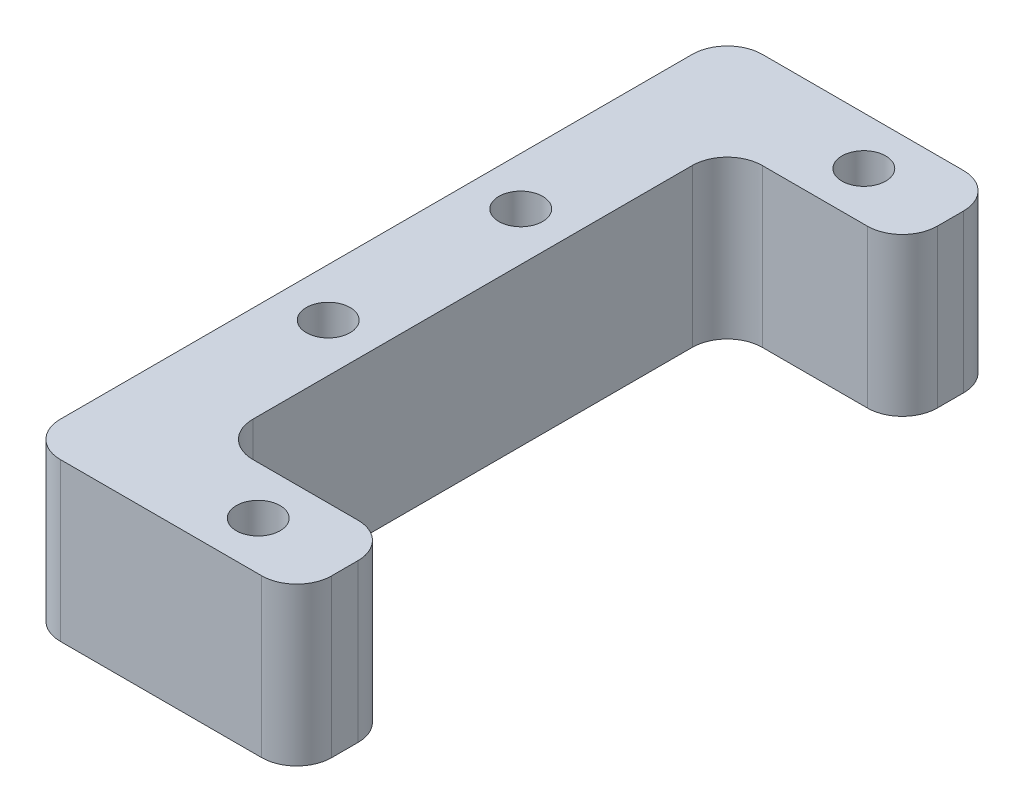
ISO-10303-21;
HEADER;
FILE_DESCRIPTION(('STEP AP214'),'2;1');
FILE_NAME('part.step','',(''),(''),'','','');
FILE_SCHEMA(('AUTOMOTIVE_DESIGN { 1 0 10303 214 1 1 1 1 }'));
ENDSEC;
DATA;
#1=APPLICATION_CONTEXT('core data for automotive mechanical design processes');
#2=APPLICATION_PROTOCOL_DEFINITION('international standard','automotive_design',2000,#1);
#3=PRODUCT_CONTEXT('',#1,'mechanical');
#4=PRODUCT('Part','Part','',(#3));
#5=PRODUCT_RELATED_PRODUCT_CATEGORY('part','',(#4));
#6=PRODUCT_DEFINITION_FORMATION('','',#4);
#7=PRODUCT_DEFINITION_CONTEXT('part definition',#1,'design');
#8=PRODUCT_DEFINITION('design','',#6,#7);
#9=PRODUCT_DEFINITION_SHAPE('','',#8);
#10=(LENGTH_UNIT() NAMED_UNIT(*) SI_UNIT(.MILLI.,.METRE.));
#11=(NAMED_UNIT(*) PLANE_ANGLE_UNIT() SI_UNIT($,.RADIAN.));
#12=(NAMED_UNIT(*) SI_UNIT($,.STERADIAN.) SOLID_ANGLE_UNIT());
#13=UNCERTAINTY_MEASURE_WITH_UNIT(LENGTH_MEASURE(1.E-05),#10,'distance_accuracy_value','');
#14=(GEOMETRIC_REPRESENTATION_CONTEXT(3) GLOBAL_UNCERTAINTY_ASSIGNED_CONTEXT((#13)) GLOBAL_UNIT_ASSIGNED_CONTEXT((#10,
#11,#12)) REPRESENTATION_CONTEXT('',''));
#15=CARTESIAN_POINT('',(0.,0.,0.));
#16=DIRECTION('',(0.,0.,1.));
#17=DIRECTION('',(1.,0.,0.));
#18=AXIS2_PLACEMENT_3D('',#15,#16,#17);
#19=CARTESIAN_POINT('',(0.,9.,0.));
#20=DIRECTION('',(0.,-1.,0.));
#21=DIRECTION('',(0.,0.,-1.));
#22=AXIS2_PLACEMENT_3D('',#19,#20,#21);
#23=PLANE('',#22);
#24=DIRECTION('',(0.,0.,-1.));
#25=VECTOR('',#24,1.);
#26=CARTESIAN_POINT('',(15.5,9.,-20.05));
#27=LINE('',#26,#25);
#28=CARTESIAN_POINT('',(15.5,9.,-16.55));
#29=VERTEX_POINT('',#28);
#30=CARTESIAN_POINT('',(15.5,9.,-18.05));
#31=VERTEX_POINT('',#30);
#32=EDGE_CURVE('E184',#29,#31,#27,.T.);
#33=ORIENTED_EDGE('',*,*,#32,.T.);
#34=CARTESIAN_POINT('',(13.5,9.,-18.05));
#35=DIRECTION('',(0.,-1.,0.));
#36=DIRECTION('',(0.,0.,-1.));
#37=AXIS2_PLACEMENT_3D('',#34,#35,#36);
#38=CIRCLE('',#37,2.);
#39=CARTESIAN_POINT('',(13.5,9.,-20.05));
#40=VERTEX_POINT('',#39);
#41=EDGE_CURVE('E224',#31,#40,#38,.F.);
#42=ORIENTED_EDGE('',*,*,#41,.T.);
#43=DIRECTION('',(-1.,0.,0.));
#44=VECTOR('',#43,1.);
#45=CARTESIAN_POINT('',(0.,9.,-20.05));
#46=LINE('',#45,#44);
#47=CARTESIAN_POINT('',(2.,9.,-20.05));
#48=VERTEX_POINT('',#47);
#49=EDGE_CURVE('E167',#40,#48,#46,.T.);
#50=ORIENTED_EDGE('',*,*,#49,.T.);
#51=CARTESIAN_POINT('',(2.,9.,-18.05));
#52=DIRECTION('',(0.,-1.,0.));
#53=DIRECTION('',(0.,0.,-1.));
#54=AXIS2_PLACEMENT_3D('',#51,#52,#53);
#55=CIRCLE('',#54,2.);
#56=CARTESIAN_POINT('',(0.,9.,-18.05));
#57=VERTEX_POINT('',#56);
#58=EDGE_CURVE('E214',#48,#57,#55,.F.);
#59=ORIENTED_EDGE('',*,*,#58,.T.);
#60=DIRECTION('',(0.,0.,1.));
#61=VECTOR('',#60,1.);
#62=CARTESIAN_POINT('',(0.,9.,20.05));
#63=LINE('',#62,#61);
#64=CARTESIAN_POINT('',(0.,9.,18.05));
#65=VERTEX_POINT('',#64);
#66=EDGE_CURVE('E286',#57,#65,#63,.T.);
#67=ORIENTED_EDGE('',*,*,#66,.T.);
#68=CARTESIAN_POINT('',(2.,9.,18.05));
#69=DIRECTION('',(0.,-1.,0.));
#70=DIRECTION('',(0.,0.,-1.));
#71=AXIS2_PLACEMENT_3D('',#68,#69,#70);
#72=CIRCLE('',#71,2.);
#73=CARTESIAN_POINT('',(2.,9.,20.05));
#74=VERTEX_POINT('',#73);
#75=EDGE_CURVE('E216',#65,#74,#72,.F.);
#76=ORIENTED_EDGE('',*,*,#75,.T.);
#77=DIRECTION('',(1.,0.,0.));
#78=VECTOR('',#77,1.);
#79=CARTESIAN_POINT('',(0.,9.,20.05));
#80=LINE('',#79,#78);
#81=CARTESIAN_POINT('',(13.5,9.,20.05));
#82=VERTEX_POINT('',#81);
#83=EDGE_CURVE('E283',#74,#82,#80,.T.);
#84=ORIENTED_EDGE('',*,*,#83,.T.);
#85=CARTESIAN_POINT('',(13.5,9.,18.05));
#86=DIRECTION('',(0.,-1.,0.));
#87=DIRECTION('',(0.,0.,-1.));
#88=AXIS2_PLACEMENT_3D('',#85,#86,#87);
#89=CIRCLE('',#88,2.);
#90=CARTESIAN_POINT('',(15.5,9.,18.05));
#91=VERTEX_POINT('',#90);
#92=EDGE_CURVE('E218',#82,#91,#89,.F.);
#93=ORIENTED_EDGE('',*,*,#92,.T.);
#94=DIRECTION('',(0.,0.,-1.));
#95=VECTOR('',#94,1.);
#96=CARTESIAN_POINT('',(15.5,9.,20.05));
#97=LINE('',#96,#95);
#98=CARTESIAN_POINT('',(15.5,9.,16.55));
#99=VERTEX_POINT('',#98);
#100=EDGE_CURVE('E278',#91,#99,#97,.T.);
#101=ORIENTED_EDGE('',*,*,#100,.T.);
#102=CARTESIAN_POINT('',(13.5,9.,16.55));
#103=DIRECTION('',(0.,-1.,0.));
#104=DIRECTION('',(0.,0.,-1.));
#105=AXIS2_PLACEMENT_3D('',#102,#103,#104);
#106=CIRCLE('',#105,2.);
#107=CARTESIAN_POINT('',(13.5,9.,14.55));
#108=VERTEX_POINT('',#107);
#109=EDGE_CURVE('E220',#99,#108,#106,.F.);
#110=ORIENTED_EDGE('',*,*,#109,.T.);
#111=DIRECTION('',(-1.,0.,0.));
#112=VECTOR('',#111,1.);
#113=CARTESIAN_POINT('',(15.5,9.,14.55));
#114=LINE('',#113,#112);
#115=CARTESIAN_POINT('',(7.49999999999999,9.,14.55));
#116=VERTEX_POINT('',#115);
#117=EDGE_CURVE('E272',#108,#116,#114,.T.);
#118=ORIENTED_EDGE('',*,*,#117,.T.);
#119=CARTESIAN_POINT('',(7.5,9.,12.55));
#120=DIRECTION('',(0.,-1.,0.));
#121=DIRECTION('',(0.,0.,-1.));
#122=AXIS2_PLACEMENT_3D('',#119,#120,#121);
#123=CIRCLE('',#122,2.);
#124=CARTESIAN_POINT('',(5.5,9.,12.55));
#125=VERTEX_POINT('',#124);
#126=EDGE_CURVE('E11',#116,#125,#123,.T.);
#127=ORIENTED_EDGE('',*,*,#126,.T.);
#128=DIRECTION('',(0.,0.,-1.));
#129=VECTOR('',#128,1.);
#130=CARTESIAN_POINT('',(5.5,9.,-14.55));
#131=LINE('',#130,#129);
#132=CARTESIAN_POINT('',(5.5,9.,-12.55));
#133=VERTEX_POINT('',#132);
#134=EDGE_CURVE('E271',#125,#133,#131,.T.);
#135=ORIENTED_EDGE('',*,*,#134,.T.);
#136=CARTESIAN_POINT('',(7.5,9.,-12.55));
#137=DIRECTION('',(0.,-1.,0.));
#138=DIRECTION('',(0.,0.,-1.));
#139=AXIS2_PLACEMENT_3D('',#136,#137,#138);
#140=CIRCLE('',#139,2.);
#141=CARTESIAN_POINT('',(7.49999999999999,9.,-14.55));
#142=VERTEX_POINT('',#141);
#143=EDGE_CURVE('E55',#133,#142,#140,.T.);
#144=ORIENTED_EDGE('',*,*,#143,.T.);
#145=DIRECTION('',(1.,0.,0.));
#146=VECTOR('',#145,1.);
#147=CARTESIAN_POINT('',(15.5,9.,-14.55));
#148=LINE('',#147,#146);
#149=CARTESIAN_POINT('',(13.5,9.,-14.55));
#150=VERTEX_POINT('',#149);
#151=EDGE_CURVE('E276',#142,#150,#148,.T.);
#152=ORIENTED_EDGE('',*,*,#151,.T.);
#153=CARTESIAN_POINT('',(13.5,9.,-16.55));
#154=DIRECTION('',(0.,-1.,0.));
#155=DIRECTION('',(0.,0.,-1.));
#156=AXIS2_PLACEMENT_3D('',#153,#154,#155);
#157=CIRCLE('',#156,2.);
#158=EDGE_CURVE('E222',#150,#29,#157,.F.);
#159=ORIENTED_EDGE('',*,*,#158,.T.);
#160=EDGE_LOOP('',(#33,#42,#50,#59,#67,#76,#84,#93,#101,#110,#118,#127,#135,#144,#152,#159));
#161=FACE_BOUND('',#160,.T.);
#162=CARTESIAN_POINT('',(2.75,9.,-5.5));
#163=DIRECTION('',(0.,1.,0.));
#164=DIRECTION('',(0.,0.,1.));
#165=AXIS2_PLACEMENT_3D('',#162,#163,#164);
#166=CIRCLE('',#165,1.25);
#167=CARTESIAN_POINT('',(2.75,9.,-4.25));
#168=VERTEX_POINT('',#167);
#169=EDGE_CURVE('E175',#168,#168,#166,.T.);
#170=ORIENTED_EDGE('',*,*,#169,.F.);
#171=EDGE_LOOP('',(#170));
#172=FACE_BOUND('',#171,.T.);
#173=CARTESIAN_POINT('',(10.55,9.,-17.3));
#174=DIRECTION('',(0.,1.,0.));
#175=DIRECTION('',(0.,0.,1.));
#176=AXIS2_PLACEMENT_3D('',#173,#174,#175);
#177=CIRCLE('',#176,1.25);
#178=CARTESIAN_POINT('',(10.55,9.,-16.05));
#179=VERTEX_POINT('',#178);
#180=EDGE_CURVE('E291',#179,#179,#177,.T.);
#181=ORIENTED_EDGE('',*,*,#180,.F.);
#182=EDGE_LOOP('',(#181));
#183=FACE_BOUND('',#182,.T.);
#184=CARTESIAN_POINT('',(10.55,9.,17.3));
#185=DIRECTION('',(0.,1.,0.));
#186=DIRECTION('',(0.,0.,-1.));
#187=AXIS2_PLACEMENT_3D('',#184,#185,#186);
#188=CIRCLE('',#187,1.25);
#189=CARTESIAN_POINT('',(10.55,9.,16.05));
#190=VERTEX_POINT('',#189);
#191=EDGE_CURVE('E296',#190,#190,#188,.T.);
#192=ORIENTED_EDGE('',*,*,#191,.F.);
#193=EDGE_LOOP('',(#192));
#194=FACE_BOUND('',#193,.T.);
#195=CARTESIAN_POINT('',(2.75,9.,5.5));
#196=DIRECTION('',(0.,1.,0.));
#197=DIRECTION('',(0.,0.,-1.));
#198=AXIS2_PLACEMENT_3D('',#195,#196,#197);
#199=CIRCLE('',#198,1.25);
#200=CARTESIAN_POINT('',(2.75,9.,4.25));
#201=VERTEX_POINT('',#200);
#202=EDGE_CURVE('E302',#201,#201,#199,.T.);
#203=ORIENTED_EDGE('',*,*,#202,.F.);
#204=EDGE_LOOP('',(#203));
#205=FACE_BOUND('',#204,.T.);
#206=ADVANCED_FACE('F33',(#161,#172,#183,#194,#205),#23,.F.);
#207=CARTESIAN_POINT('',(0.,0.,0.));
#208=DIRECTION('',(0.,-1.,0.));
#209=DIRECTION('',(0.,0.,-1.));
#210=AXIS2_PLACEMENT_3D('',#207,#208,#209);
#211=PLANE('',#210);
#212=CARTESIAN_POINT('',(10.55,0.,17.3));
#213=DIRECTION('',(0.,1.,0.));
#214=DIRECTION('',(0.,0.,-1.));
#215=AXIS2_PLACEMENT_3D('',#212,#213,#214);
#216=CIRCLE('',#215,1.25);
#217=CARTESIAN_POINT('',(10.55,0.,16.05));
#218=VERTEX_POINT('',#217);
#219=EDGE_CURVE('E299',#218,#218,#216,.T.);
#220=ORIENTED_EDGE('',*,*,#219,.T.);
#221=EDGE_LOOP('',(#220));
#222=FACE_BOUND('',#221,.T.);
#223=CARTESIAN_POINT('',(2.75,0.,-5.5));
#224=DIRECTION('',(0.,1.,0.));
#225=DIRECTION('',(0.,0.,1.));
#226=AXIS2_PLACEMENT_3D('',#223,#224,#225);
#227=CIRCLE('',#226,1.25);
#228=CARTESIAN_POINT('',(2.75,0.,-4.25));
#229=VERTEX_POINT('',#228);
#230=EDGE_CURVE('E181',#229,#229,#227,.T.);
#231=ORIENTED_EDGE('',*,*,#230,.T.);
#232=EDGE_LOOP('',(#231));
#233=FACE_BOUND('',#232,.T.);
#234=DIRECTION('',(-1.,0.,0.));
#235=VECTOR('',#234,1.);
#236=CARTESIAN_POINT('',(0.,0.,-20.05));
#237=LINE('',#236,#235);
#238=CARTESIAN_POINT('',(13.5,0.,-20.05));
#239=VERTEX_POINT('',#238);
#240=CARTESIAN_POINT('',(2.,0.,-20.05));
#241=VERTEX_POINT('',#240);
#242=EDGE_CURVE('E164',#239,#241,#237,.T.);
#243=ORIENTED_EDGE('',*,*,#242,.F.);
#244=CARTESIAN_POINT('',(13.5,0.,-18.05));
#245=DIRECTION('',(0.,-1.,0.));
#246=DIRECTION('',(0.,0.,-1.));
#247=AXIS2_PLACEMENT_3D('',#244,#245,#246);
#248=CIRCLE('',#247,2.);
#249=CARTESIAN_POINT('',(15.5,0.,-18.05));
#250=VERTEX_POINT('',#249);
#251=EDGE_CURVE('E147',#239,#250,#248,.T.);
#252=ORIENTED_EDGE('',*,*,#251,.T.);
#253=DIRECTION('',(0.,0.,-1.));
#254=VECTOR('',#253,1.);
#255=CARTESIAN_POINT('',(15.5,0.,-20.05));
#256=LINE('',#255,#254);
#257=CARTESIAN_POINT('',(15.5,0.,-16.55));
#258=VERTEX_POINT('',#257);
#259=EDGE_CURVE('E200',#258,#250,#256,.T.);
#260=ORIENTED_EDGE('',*,*,#259,.F.);
#261=CARTESIAN_POINT('',(13.5,0.,-16.55));
#262=DIRECTION('',(0.,-1.,0.));
#263=DIRECTION('',(0.,0.,-1.));
#264=AXIS2_PLACEMENT_3D('',#261,#262,#263);
#265=CIRCLE('',#264,2.);
#266=CARTESIAN_POINT('',(13.5,0.,-14.55));
#267=VERTEX_POINT('',#266);
#268=EDGE_CURVE('E158',#258,#267,#265,.T.);
#269=ORIENTED_EDGE('',*,*,#268,.T.);
#270=DIRECTION('',(1.,0.,0.));
#271=VECTOR('',#270,1.);
#272=CARTESIAN_POINT('',(15.5,0.,-14.55));
#273=LINE('',#272,#271);
#274=CARTESIAN_POINT('',(7.49999999999999,0.,-14.55));
#275=VERTEX_POINT('',#274);
#276=EDGE_CURVE('E198',#275,#267,#273,.T.);
#277=ORIENTED_EDGE('',*,*,#276,.F.);
#278=CARTESIAN_POINT('',(7.5,0.,-12.55));
#279=DIRECTION('',(0.,-1.,0.));
#280=DIRECTION('',(0.,0.,-1.));
#281=AXIS2_PLACEMENT_3D('',#278,#279,#280);
#282=CIRCLE('',#281,2.);
#283=CARTESIAN_POINT('',(5.5,0.,-12.55));
#284=VERTEX_POINT('',#283);
#285=EDGE_CURVE('E255',#275,#284,#282,.F.);
#286=ORIENTED_EDGE('',*,*,#285,.T.);
#287=DIRECTION('',(0.,0.,-1.));
#288=VECTOR('',#287,1.);
#289=CARTESIAN_POINT('',(5.5,0.,-14.55));
#290=LINE('',#289,#288);
#291=CARTESIAN_POINT('',(5.5,0.,12.55));
#292=VERTEX_POINT('',#291);
#293=EDGE_CURVE('E195',#292,#284,#290,.T.);
#294=ORIENTED_EDGE('',*,*,#293,.F.);
#295=CARTESIAN_POINT('',(7.5,0.,12.55));
#296=DIRECTION('',(0.,-1.,0.));
#297=DIRECTION('',(0.,0.,-1.));
#298=AXIS2_PLACEMENT_3D('',#295,#296,#297);
#299=CIRCLE('',#298,2.);
#300=CARTESIAN_POINT('',(7.49999999999999,0.,14.55));
#301=VERTEX_POINT('',#300);
#302=EDGE_CURVE('E41',#292,#301,#299,.F.);
#303=ORIENTED_EDGE('',*,*,#302,.T.);
#304=DIRECTION('',(-1.,0.,0.));
#305=VECTOR('',#304,1.);
#306=CARTESIAN_POINT('',(15.5,0.,14.55));
#307=LINE('',#306,#305);
#308=CARTESIAN_POINT('',(13.5,0.,14.55));
#309=VERTEX_POINT('',#308);
#310=EDGE_CURVE('E192',#309,#301,#307,.T.);
#311=ORIENTED_EDGE('',*,*,#310,.F.);
#312=CARTESIAN_POINT('',(13.5,0.,16.55));
#313=DIRECTION('',(0.,-1.,0.));
#314=DIRECTION('',(0.,0.,-1.));
#315=AXIS2_PLACEMENT_3D('',#312,#313,#314);
#316=CIRCLE('',#315,2.);
#317=CARTESIAN_POINT('',(15.5,0.,16.55));
#318=VERTEX_POINT('',#317);
#319=EDGE_CURVE('E208',#309,#318,#316,.T.);
#320=ORIENTED_EDGE('',*,*,#319,.T.);
#321=DIRECTION('',(0.,0.,-1.));
#322=VECTOR('',#321,1.);
#323=CARTESIAN_POINT('',(15.5,0.,20.05));
#324=LINE('',#323,#322);
#325=CARTESIAN_POINT('',(15.5,0.,18.05));
#326=VERTEX_POINT('',#325);
#327=EDGE_CURVE('E189',#326,#318,#324,.T.);
#328=ORIENTED_EDGE('',*,*,#327,.F.);
#329=CARTESIAN_POINT('',(13.5,0.,18.05));
#330=DIRECTION('',(0.,-1.,0.));
#331=DIRECTION('',(0.,0.,-1.));
#332=AXIS2_PLACEMENT_3D('',#329,#330,#331);
#333=CIRCLE('',#332,2.);
#334=CARTESIAN_POINT('',(13.5,0.,20.05));
#335=VERTEX_POINT('',#334);
#336=EDGE_CURVE('E206',#326,#335,#333,.T.);
#337=ORIENTED_EDGE('',*,*,#336,.T.);
#338=DIRECTION('',(1.,0.,0.));
#339=VECTOR('',#338,1.);
#340=CARTESIAN_POINT('',(0.,0.,20.05));
#341=LINE('',#340,#339);
#342=CARTESIAN_POINT('',(2.,0.,20.05));
#343=VERTEX_POINT('',#342);
#344=EDGE_CURVE('E178',#343,#335,#341,.T.);
#345=ORIENTED_EDGE('',*,*,#344,.F.);
#346=CARTESIAN_POINT('',(2.,0.,18.05));
#347=DIRECTION('',(0.,-1.,0.));
#348=DIRECTION('',(0.,0.,-1.));
#349=AXIS2_PLACEMENT_3D('',#346,#347,#348);
#350=CIRCLE('',#349,2.);
#351=CARTESIAN_POINT('',(0.,0.,18.05));
#352=VERTEX_POINT('',#351);
#353=EDGE_CURVE('E204',#343,#352,#350,.T.);
#354=ORIENTED_EDGE('',*,*,#353,.T.);
#355=DIRECTION('',(0.,0.,1.));
#356=VECTOR('',#355,1.);
#357=CARTESIAN_POINT('',(0.,0.,20.05));
#358=LINE('',#357,#356);
#359=CARTESIAN_POINT('',(0.,0.,-18.05));
#360=VERTEX_POINT('',#359);
#361=EDGE_CURVE('E174',#360,#352,#358,.T.);
#362=ORIENTED_EDGE('',*,*,#361,.F.);
#363=CARTESIAN_POINT('',(2.,0.,-18.05));
#364=DIRECTION('',(0.,-1.,0.));
#365=DIRECTION('',(0.,0.,-1.));
#366=AXIS2_PLACEMENT_3D('',#363,#364,#365);
#367=CIRCLE('',#366,2.);
#368=EDGE_CURVE('E168',#360,#241,#367,.T.);
#369=ORIENTED_EDGE('',*,*,#368,.T.);
#370=EDGE_LOOP('',(#243,#252,#260,#269,#277,#286,#294,#303,#311,#320,#328,#337,#345,#354,#362,#369));
#371=FACE_BOUND('',#370,.T.);
#372=CARTESIAN_POINT('',(10.55,0.,-17.3));
#373=DIRECTION('',(0.,1.,0.));
#374=DIRECTION('',(0.,0.,1.));
#375=AXIS2_PLACEMENT_3D('',#372,#373,#374);
#376=CIRCLE('',#375,1.25);
#377=CARTESIAN_POINT('',(10.55,0.,-16.05));
#378=VERTEX_POINT('',#377);
#379=EDGE_CURVE('E293',#378,#378,#376,.T.);
#380=ORIENTED_EDGE('',*,*,#379,.T.);
#381=EDGE_LOOP('',(#380));
#382=FACE_BOUND('',#381,.T.);
#383=CARTESIAN_POINT('',(2.75,0.,5.5));
#384=DIRECTION('',(0.,1.,0.));
#385=DIRECTION('',(0.,0.,-1.));
#386=AXIS2_PLACEMENT_3D('',#383,#384,#385);
#387=CIRCLE('',#386,1.25);
#388=CARTESIAN_POINT('',(2.75,0.,4.25));
#389=VERTEX_POINT('',#388);
#390=EDGE_CURVE('E305',#389,#389,#387,.T.);
#391=ORIENTED_EDGE('',*,*,#390,.T.);
#392=EDGE_LOOP('',(#391));
#393=FACE_BOUND('',#392,.T.);
#394=ADVANCED_FACE('F171',(#222,#233,#371,#382,#393),#211,.T.);
#395=CARTESIAN_POINT('',(0.,9.,-20.05));
#396=DIRECTION('',(0.,0.,1.));
#397=DIRECTION('',(1.,0.,0.));
#398=AXIS2_PLACEMENT_3D('',#395,#396,#397);
#399=PLANE('',#398);
#400=ORIENTED_EDGE('',*,*,#49,.F.);
#401=DIRECTION('',(0.,-1.,0.));
#402=VECTOR('',#401,1.);
#403=CARTESIAN_POINT('',(13.5,9.,-20.05));
#404=LINE('',#403,#402);
#405=EDGE_CURVE('E151',#40,#239,#404,.T.);
#406=ORIENTED_EDGE('',*,*,#405,.T.);
#407=ORIENTED_EDGE('',*,*,#242,.T.);
#408=DIRECTION('',(0.,-1.,0.));
#409=VECTOR('',#408,1.);
#410=CARTESIAN_POINT('',(2.,9.,-20.05));
#411=LINE('',#410,#409);
#412=EDGE_CURVE('E169',#241,#48,#411,.F.);
#413=ORIENTED_EDGE('',*,*,#412,.T.);
#414=EDGE_LOOP('',(#400,#406,#407,#413));
#415=FACE_BOUND('',#414,.T.);
#416=ADVANCED_FACE('F163',(#415),#399,.F.);
#417=CARTESIAN_POINT('',(0.,9.,20.05));
#418=DIRECTION('',(1.,0.,0.));
#419=DIRECTION('',(0.,0.,-1.));
#420=AXIS2_PLACEMENT_3D('',#417,#418,#419);
#421=PLANE('',#420);
#422=ORIENTED_EDGE('',*,*,#361,.T.);
#423=DIRECTION('',(0.,-1.,0.));
#424=VECTOR('',#423,1.);
#425=CARTESIAN_POINT('',(0.,9.,18.05));
#426=LINE('',#425,#424);
#427=EDGE_CURVE('E248',#352,#65,#426,.F.);
#428=ORIENTED_EDGE('',*,*,#427,.T.);
#429=ORIENTED_EDGE('',*,*,#66,.F.);
#430=DIRECTION('',(0.,-1.,0.));
#431=VECTOR('',#430,1.);
#432=CARTESIAN_POINT('',(0.,9.,-18.05));
#433=LINE('',#432,#431);
#434=EDGE_CURVE('E245',#57,#360,#433,.T.);
#435=ORIENTED_EDGE('',*,*,#434,.T.);
#436=EDGE_LOOP('',(#422,#428,#429,#435));
#437=FACE_BOUND('',#436,.T.);
#438=ADVANCED_FACE('F343',(#437),#421,.F.);
#439=CARTESIAN_POINT('',(0.,9.,20.05));
#440=DIRECTION('',(0.,0.,-1.));
#441=DIRECTION('',(-1.,0.,0.));
#442=AXIS2_PLACEMENT_3D('',#439,#440,#441);
#443=PLANE('',#442);
#444=ORIENTED_EDGE('',*,*,#344,.T.);
#445=DIRECTION('',(0.,-1.,0.));
#446=VECTOR('',#445,1.);
#447=CARTESIAN_POINT('',(13.5,9.,20.05));
#448=LINE('',#447,#446);
#449=EDGE_CURVE('E243',#335,#82,#448,.F.);
#450=ORIENTED_EDGE('',*,*,#449,.T.);
#451=ORIENTED_EDGE('',*,*,#83,.F.);
#452=DIRECTION('',(0.,-1.,0.));
#453=VECTOR('',#452,1.);
#454=CARTESIAN_POINT('',(2.,9.,20.05));
#455=LINE('',#454,#453);
#456=EDGE_CURVE('E240',#74,#343,#455,.T.);
#457=ORIENTED_EDGE('',*,*,#456,.T.);
#458=EDGE_LOOP('',(#444,#450,#451,#457));
#459=FACE_BOUND('',#458,.T.);
#460=ADVANCED_FACE('F339',(#459),#443,.F.);
#461=CARTESIAN_POINT('',(15.5,9.,20.05));
#462=DIRECTION('',(-1.,0.,0.));
#463=DIRECTION('',(0.,0.,1.));
#464=AXIS2_PLACEMENT_3D('',#461,#462,#463);
#465=PLANE('',#464);
#466=ORIENTED_EDGE('',*,*,#327,.T.);
#467=DIRECTION('',(0.,-1.,0.));
#468=VECTOR('',#467,1.);
#469=CARTESIAN_POINT('',(15.5,9.,16.55));
#470=LINE('',#469,#468);
#471=EDGE_CURVE('E238',#318,#99,#470,.F.);
#472=ORIENTED_EDGE('',*,*,#471,.T.);
#473=ORIENTED_EDGE('',*,*,#100,.F.);
#474=DIRECTION('',(0.,-1.,0.));
#475=VECTOR('',#474,1.);
#476=CARTESIAN_POINT('',(15.5,9.,18.05));
#477=LINE('',#476,#475);
#478=EDGE_CURVE('E235',#91,#326,#477,.T.);
#479=ORIENTED_EDGE('',*,*,#478,.T.);
#480=EDGE_LOOP('',(#466,#472,#473,#479));
#481=FACE_BOUND('',#480,.T.);
#482=ADVANCED_FACE('F336',(#481),#465,.F.);
#483=CARTESIAN_POINT('',(15.5,9.,14.55));
#484=DIRECTION('',(0.,0.,1.));
#485=DIRECTION('',(1.,0.,0.));
#486=AXIS2_PLACEMENT_3D('',#483,#484,#485);
#487=PLANE('',#486);
#488=ORIENTED_EDGE('',*,*,#117,.F.);
#489=DIRECTION('',(0.,-1.,0.));
#490=VECTOR('',#489,1.);
#491=CARTESIAN_POINT('',(13.5,9.,14.55));
#492=LINE('',#491,#490);
#493=EDGE_CURVE('E232',#108,#309,#492,.T.);
#494=ORIENTED_EDGE('',*,*,#493,.T.);
#495=ORIENTED_EDGE('',*,*,#310,.T.);
#496=DIRECTION('',(0.,-1.,0.));
#497=VECTOR('',#496,1.);
#498=CARTESIAN_POINT('',(7.5,9.,14.55));
#499=LINE('',#498,#497);
#500=EDGE_CURVE('E230',#301,#116,#499,.F.);
#501=ORIENTED_EDGE('',*,*,#500,.T.);
#502=EDGE_LOOP('',(#488,#494,#495,#501));
#503=FACE_BOUND('',#502,.T.);
#504=ADVANCED_FACE('F264',(#503),#487,.F.);
#505=CARTESIAN_POINT('',(5.5,9.,-14.55));
#506=DIRECTION('',(-1.,0.,0.));
#507=DIRECTION('',(0.,0.,1.));
#508=AXIS2_PLACEMENT_3D('',#505,#506,#507);
#509=PLANE('',#508);
#510=ORIENTED_EDGE('',*,*,#293,.T.);
#511=DIRECTION('',(0.,-1.,0.));
#512=VECTOR('',#511,1.);
#513=CARTESIAN_POINT('',(5.5,9.,-12.55));
#514=LINE('',#513,#512);
#515=EDGE_CURVE('E253',#284,#133,#514,.F.);
#516=ORIENTED_EDGE('',*,*,#515,.T.);
#517=ORIENTED_EDGE('',*,*,#134,.F.);
#518=DIRECTION('',(0.,-1.,0.));
#519=VECTOR('',#518,1.);
#520=CARTESIAN_POINT('',(5.5,0.,12.55));
#521=LINE('',#520,#519);
#522=EDGE_CURVE('E250',#125,#292,#521,.T.);
#523=ORIENTED_EDGE('',*,*,#522,.T.);
#524=EDGE_LOOP('',(#510,#516,#517,#523));
#525=FACE_BOUND('',#524,.T.);
#526=ADVANCED_FACE('F274',(#525),#509,.F.);
#527=CARTESIAN_POINT('',(15.5,9.,-14.55));
#528=DIRECTION('',(0.,0.,-1.));
#529=DIRECTION('',(-1.,0.,0.));
#530=AXIS2_PLACEMENT_3D('',#527,#528,#529);
#531=PLANE('',#530);
#532=ORIENTED_EDGE('',*,*,#276,.T.);
#533=DIRECTION('',(0.,-1.,0.));
#534=VECTOR('',#533,1.);
#535=CARTESIAN_POINT('',(13.5,9.,-14.55));
#536=LINE('',#535,#534);
#537=EDGE_CURVE('E48',#267,#150,#536,.F.);
#538=ORIENTED_EDGE('',*,*,#537,.T.);
#539=ORIENTED_EDGE('',*,*,#151,.F.);
#540=DIRECTION('',(0.,-1.,0.));
#541=VECTOR('',#540,1.);
#542=CARTESIAN_POINT('',(7.5,0.,-14.55));
#543=LINE('',#542,#541);
#544=EDGE_CURVE('E226',#142,#275,#543,.T.);
#545=ORIENTED_EDGE('',*,*,#544,.T.);
#546=EDGE_LOOP('',(#532,#538,#539,#545));
#547=FACE_BOUND('',#546,.T.);
#548=ADVANCED_FACE('F328',(#547),#531,.F.);
#549=CARTESIAN_POINT('',(15.5,9.,-20.05));
#550=DIRECTION('',(-1.,0.,0.));
#551=DIRECTION('',(0.,0.,1.));
#552=AXIS2_PLACEMENT_3D('',#549,#550,#551);
#553=PLANE('',#552);
#554=ORIENTED_EDGE('',*,*,#259,.T.);
#555=DIRECTION('',(0.,-1.,0.));
#556=VECTOR('',#555,1.);
#557=CARTESIAN_POINT('',(15.5,9.,-18.05));
#558=LINE('',#557,#556);
#559=EDGE_CURVE('E152',#250,#31,#558,.F.);
#560=ORIENTED_EDGE('',*,*,#559,.T.);
#561=ORIENTED_EDGE('',*,*,#32,.F.);
#562=DIRECTION('',(0.,-1.,0.));
#563=VECTOR('',#562,1.);
#564=CARTESIAN_POINT('',(15.5,9.,-16.55));
#565=LINE('',#564,#563);
#566=EDGE_CURVE('E157',#29,#258,#565,.T.);
#567=ORIENTED_EDGE('',*,*,#566,.T.);
#568=EDGE_LOOP('',(#554,#560,#561,#567));
#569=FACE_BOUND('',#568,.T.);
#570=ADVANCED_FACE('F325',(#569),#553,.F.);
#571=CARTESIAN_POINT('',(2.75,9.,-5.5));
#572=DIRECTION('',(0.,-1.,0.));
#573=DIRECTION('',(0.,0.,-1.));
#574=AXIS2_PLACEMENT_3D('',#571,#572,#573);
#575=CYLINDRICAL_SURFACE('',#574,1.25);
#576=ORIENTED_EDGE('',*,*,#169,.T.);
#577=EDGE_LOOP('',(#576));
#578=FACE_BOUND('',#577,.T.);
#579=ORIENTED_EDGE('',*,*,#230,.F.);
#580=EDGE_LOOP('',(#579));
#581=FACE_BOUND('',#580,.T.);
#582=ADVANCED_FACE('F322',(#578,#581),#575,.F.);
#583=CARTESIAN_POINT('',(10.55,9.,-17.3));
#584=DIRECTION('',(0.,-1.,0.));
#585=DIRECTION('',(0.,0.,-1.));
#586=AXIS2_PLACEMENT_3D('',#583,#584,#585);
#587=CYLINDRICAL_SURFACE('',#586,1.25);
#588=ORIENTED_EDGE('',*,*,#180,.T.);
#589=EDGE_LOOP('',(#588));
#590=FACE_BOUND('',#589,.T.);
#591=ORIENTED_EDGE('',*,*,#379,.F.);
#592=EDGE_LOOP('',(#591));
#593=FACE_BOUND('',#592,.T.);
#594=ADVANCED_FACE('F517',(#590,#593),#587,.F.);
#595=CARTESIAN_POINT('',(10.55,9.,17.3));
#596=DIRECTION('',(0.,-1.,0.));
#597=DIRECTION('',(0.,0.,-1.));
#598=AXIS2_PLACEMENT_3D('',#595,#596,#597);
#599=CYLINDRICAL_SURFACE('',#598,1.25);
#600=ORIENTED_EDGE('',*,*,#191,.T.);
#601=EDGE_LOOP('',(#600));
#602=FACE_BOUND('',#601,.T.);
#603=ORIENTED_EDGE('',*,*,#219,.F.);
#604=EDGE_LOOP('',(#603));
#605=FACE_BOUND('',#604,.T.);
#606=ADVANCED_FACE('F508',(#602,#605),#599,.F.);
#607=CARTESIAN_POINT('',(2.75,9.,5.5));
#608=DIRECTION('',(0.,-1.,0.));
#609=DIRECTION('',(0.,0.,-1.));
#610=AXIS2_PLACEMENT_3D('',#607,#608,#609);
#611=CYLINDRICAL_SURFACE('',#610,1.25);
#612=ORIENTED_EDGE('',*,*,#202,.T.);
#613=EDGE_LOOP('',(#612));
#614=FACE_BOUND('',#613,.T.);
#615=ORIENTED_EDGE('',*,*,#390,.F.);
#616=EDGE_LOOP('',(#615));
#617=FACE_BOUND('',#616,.T.);
#618=ADVANCED_FACE('F311',(#614,#617),#611,.F.);
#619=CARTESIAN_POINT('',(13.5,9.,-18.05));
#620=DIRECTION('',(0.,-1.,0.));
#621=DIRECTION('',(0.,0.,-1.));
#622=AXIS2_PLACEMENT_3D('',#619,#620,#621);
#623=CYLINDRICAL_SURFACE('',#622,2.);
#624=ORIENTED_EDGE('',*,*,#41,.F.);
#625=ORIENTED_EDGE('',*,*,#559,.F.);
#626=ORIENTED_EDGE('',*,*,#251,.F.);
#627=ORIENTED_EDGE('',*,*,#405,.F.);
#628=EDGE_LOOP('',(#624,#625,#626,#627));
#629=FACE_BOUND('',#628,.T.);
#630=ADVANCED_FACE('F150',(#629),#623,.T.);
#631=CARTESIAN_POINT('',(13.5,9.,-16.55));
#632=DIRECTION('',(0.,-1.,0.));
#633=DIRECTION('',(0.,0.,-1.));
#634=AXIS2_PLACEMENT_3D('',#631,#632,#633);
#635=CYLINDRICAL_SURFACE('',#634,2.);
#636=ORIENTED_EDGE('',*,*,#158,.F.);
#637=ORIENTED_EDGE('',*,*,#537,.F.);
#638=ORIENTED_EDGE('',*,*,#268,.F.);
#639=ORIENTED_EDGE('',*,*,#566,.F.);
#640=EDGE_LOOP('',(#636,#637,#638,#639));
#641=FACE_BOUND('',#640,.T.);
#642=ADVANCED_FACE('F352',(#641),#635,.T.);
#643=CARTESIAN_POINT('',(13.5,9.,16.55));
#644=DIRECTION('',(0.,-1.,0.));
#645=DIRECTION('',(0.,0.,-1.));
#646=AXIS2_PLACEMENT_3D('',#643,#644,#645);
#647=CYLINDRICAL_SURFACE('',#646,2.);
#648=ORIENTED_EDGE('',*,*,#109,.F.);
#649=ORIENTED_EDGE('',*,*,#471,.F.);
#650=ORIENTED_EDGE('',*,*,#319,.F.);
#651=ORIENTED_EDGE('',*,*,#493,.F.);
#652=EDGE_LOOP('',(#648,#649,#650,#651));
#653=FACE_BOUND('',#652,.T.);
#654=ADVANCED_FACE('F355',(#653),#647,.T.);
#655=CARTESIAN_POINT('',(13.5,9.,18.05));
#656=DIRECTION('',(0.,-1.,0.));
#657=DIRECTION('',(0.,0.,-1.));
#658=AXIS2_PLACEMENT_3D('',#655,#656,#657);
#659=CYLINDRICAL_SURFACE('',#658,2.);
#660=ORIENTED_EDGE('',*,*,#92,.F.);
#661=ORIENTED_EDGE('',*,*,#449,.F.);
#662=ORIENTED_EDGE('',*,*,#336,.F.);
#663=ORIENTED_EDGE('',*,*,#478,.F.);
#664=EDGE_LOOP('',(#660,#661,#662,#663));
#665=FACE_BOUND('',#664,.T.);
#666=ADVANCED_FACE('F359',(#665),#659,.T.);
#667=CARTESIAN_POINT('',(2.,9.,18.05));
#668=DIRECTION('',(0.,-1.,0.));
#669=DIRECTION('',(0.,0.,-1.));
#670=AXIS2_PLACEMENT_3D('',#667,#668,#669);
#671=CYLINDRICAL_SURFACE('',#670,2.);
#672=ORIENTED_EDGE('',*,*,#75,.F.);
#673=ORIENTED_EDGE('',*,*,#427,.F.);
#674=ORIENTED_EDGE('',*,*,#353,.F.);
#675=ORIENTED_EDGE('',*,*,#456,.F.);
#676=EDGE_LOOP('',(#672,#673,#674,#675));
#677=FACE_BOUND('',#676,.T.);
#678=ADVANCED_FACE('F363',(#677),#671,.T.);
#679=CARTESIAN_POINT('',(2.,9.,-18.05));
#680=DIRECTION('',(0.,-1.,0.));
#681=DIRECTION('',(0.,0.,-1.));
#682=AXIS2_PLACEMENT_3D('',#679,#680,#681);
#683=CYLINDRICAL_SURFACE('',#682,2.);
#684=ORIENTED_EDGE('',*,*,#58,.F.);
#685=ORIENTED_EDGE('',*,*,#412,.F.);
#686=ORIENTED_EDGE('',*,*,#368,.F.);
#687=ORIENTED_EDGE('',*,*,#434,.F.);
#688=EDGE_LOOP('',(#684,#685,#686,#687));
#689=FACE_BOUND('',#688,.T.);
#690=ADVANCED_FACE('F367',(#689),#683,.T.);
#691=CARTESIAN_POINT('',(7.5,9.,-12.55));
#692=DIRECTION('',(0.,1.,0.));
#693=DIRECTION('',(0.,0.,1.));
#694=AXIS2_PLACEMENT_3D('',#691,#692,#693);
#695=CYLINDRICAL_SURFACE('',#694,2.);
#696=ORIENTED_EDGE('',*,*,#143,.F.);
#697=ORIENTED_EDGE('',*,*,#515,.F.);
#698=ORIENTED_EDGE('',*,*,#285,.F.);
#699=ORIENTED_EDGE('',*,*,#544,.F.);
#700=EDGE_LOOP('',(#696,#697,#698,#699));
#701=FACE_BOUND('',#700,.T.);
#702=ADVANCED_FACE('F370',(#701),#695,.F.);
#703=CARTESIAN_POINT('',(7.5,9.,12.55));
#704=DIRECTION('',(0.,1.,0.));
#705=DIRECTION('',(0.,0.,1.));
#706=AXIS2_PLACEMENT_3D('',#703,#704,#705);
#707=CYLINDRICAL_SURFACE('',#706,2.);
#708=ORIENTED_EDGE('',*,*,#126,.F.);
#709=ORIENTED_EDGE('',*,*,#500,.F.);
#710=ORIENTED_EDGE('',*,*,#302,.F.);
#711=ORIENTED_EDGE('',*,*,#522,.F.);
#712=EDGE_LOOP('',(#708,#709,#710,#711));
#713=FACE_BOUND('',#712,.T.);
#714=ADVANCED_FACE('F35',(#713),#707,.F.);
#715=CLOSED_SHELL('',(#206,#394,#416,#438,#460,#482,#504,#526,#548,#570,#582,#594,#606,#618,
#630,#642,#654,#666,#678,#690,#702,#714));
#716=MANIFOLD_SOLID_BREP('B2',#715);
#717=ADVANCED_BREP_SHAPE_REPRESENTATION('',(#18,#716),#14);
#718=SHAPE_DEFINITION_REPRESENTATION(#9,#717);
ENDSEC;
END-ISO-10303-21;
